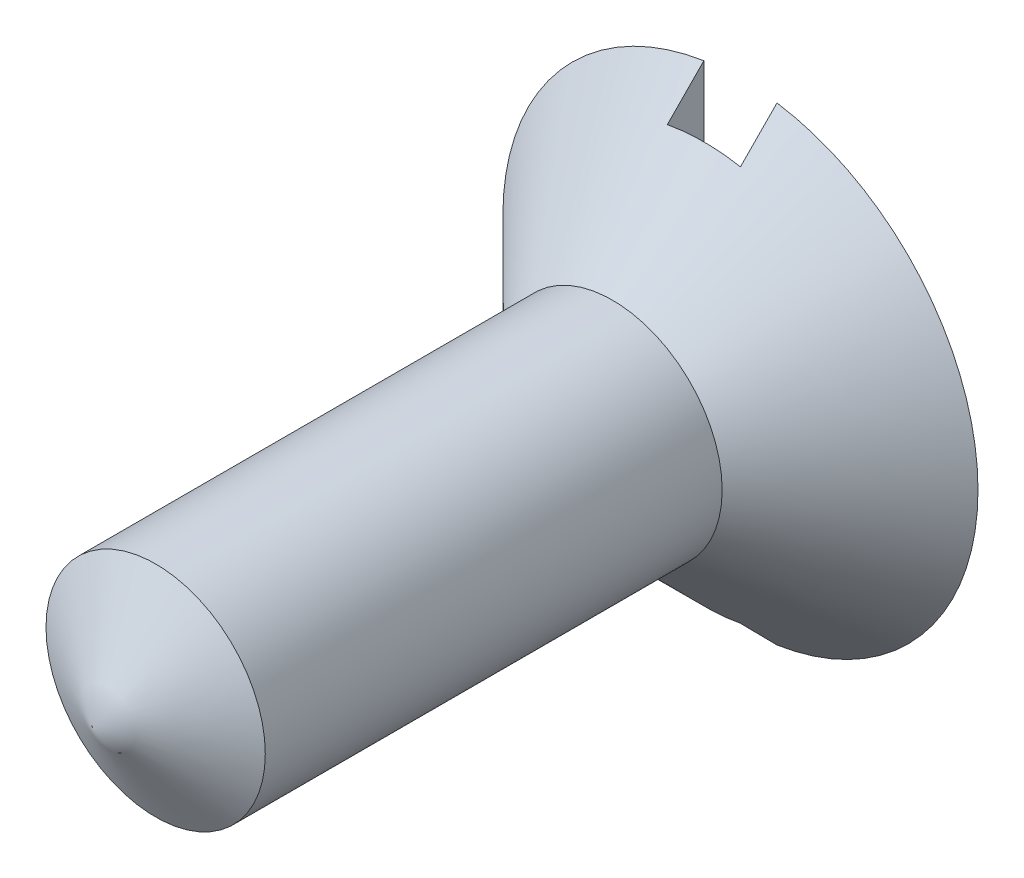
ISO-10303-21;
HEADER;
FILE_DESCRIPTION(('STEP AP214'),'2;1');
FILE_NAME('part.step','',(''),(''),'','','');
FILE_SCHEMA(('AUTOMOTIVE_DESIGN { 1 0 10303 214 1 1 1 1 }'));
ENDSEC;
DATA;
#1=APPLICATION_CONTEXT('core data for automotive mechanical design processes');
#2=APPLICATION_PROTOCOL_DEFINITION('international standard','automotive_design',2000,#1);
#3=PRODUCT_CONTEXT('',#1,'mechanical');
#4=PRODUCT('Part','Part','',(#3));
#5=PRODUCT_RELATED_PRODUCT_CATEGORY('part','',(#4));
#6=PRODUCT_DEFINITION_FORMATION('','',#4);
#7=PRODUCT_DEFINITION_CONTEXT('part definition',#1,'design');
#8=PRODUCT_DEFINITION('design','',#6,#7);
#9=PRODUCT_DEFINITION_SHAPE('','',#8);
#10=(LENGTH_UNIT() NAMED_UNIT(*) SI_UNIT(.MILLI.,.METRE.));
#11=(NAMED_UNIT(*) PLANE_ANGLE_UNIT() SI_UNIT($,.RADIAN.));
#12=(NAMED_UNIT(*) SI_UNIT($,.STERADIAN.) SOLID_ANGLE_UNIT());
#13=UNCERTAINTY_MEASURE_WITH_UNIT(LENGTH_MEASURE(1.E-05),#10,'distance_accuracy_value','');
#14=(GEOMETRIC_REPRESENTATION_CONTEXT(3) GLOBAL_UNCERTAINTY_ASSIGNED_CONTEXT((#13)) GLOBAL_UNIT_ASSIGNED_CONTEXT((#10,
#11,#12)) REPRESENTATION_CONTEXT('',''));
#15=CARTESIAN_POINT('',(0.,0.,0.));
#16=DIRECTION('',(0.,0.,1.));
#17=DIRECTION('',(1.,0.,0.));
#18=AXIS2_PLACEMENT_3D('',#15,#16,#17);
#19=CARTESIAN_POINT('',(3.19724147862266,0.,-44.721048580616));
#20=DIRECTION('',(0.,0.,-1.));
#21=DIRECTION('',(-1.00000000000001,0.,0.));
#22=AXIS2_PLACEMENT_3D('',#19,#20,#21);
#23=CONICAL_SURFACE('',#22,3.,0.785398163397455);
#24=CARTESIAN_POINT('',(3.19724147862266,0.,-44.721048580616));
#25=DIRECTION('',(0.,0.,-1.));
#26=DIRECTION('',(-1.00000000000001,0.,0.));
#27=AXIS2_PLACEMENT_3D('',#24,#25,#26);
#28=CIRCLE('',#27,3.);
#29=CARTESIAN_POINT('',(0.19724147862263,0.,-44.721048580616));
#30=VERTEX_POINT('',#29);
#31=EDGE_CURVE('E140',#30,#30,#28,.T.);
#32=ORIENTED_EDGE('',*,*,#31,.T.);
#33=EDGE_LOOP('',(#32));
#34=FACE_BOUND('',#33,.T.);
#35=CARTESIAN_POINT('',(2.19724147862231,14.2882919475461,-56.0442914668593));
#36=CARTESIAN_POINT('',(2.19724147862254,13.7931991496806,-55.5504164842917));
#37=CARTESIAN_POINT('',(2.19724147862264,13.2980529489614,-55.0565949951455));
#38=CARTESIAN_POINT('',(2.19724147862271,12.307571565195,-54.0691157505036));
#39=CARTESIAN_POINT('',(2.19724147862268,11.8122363775558,-53.5754579996139));
#40=CARTESIAN_POINT('',(2.19724147862266,10.8210233651282,-52.5880926050779));
#41=CARTESIAN_POINT('',(2.19724147862267,10.3251453930802,-52.0943851092347));
#42=CARTESIAN_POINT('',(2.19724147862267,9.3330261167956,-51.1073605080941));
#43=CARTESIAN_POINT('',(2.19724147862267,8.83678482211178,-50.6140433931953));
#44=CARTESIAN_POINT('',(2.19724147862267,7.84417904493086,-49.628486967335));
#45=CARTESIAN_POINT('',(2.19724147862267,7.34781513888531,-49.1362470762193));
#46=CARTESIAN_POINT('',(2.19724147862267,6.60243575566865,-48.3986904042511));
#47=CARTESIAN_POINT('',(2.19724147862267,6.3538272739522,-48.1529624194978));
#48=CARTESIAN_POINT('',(2.19724147862267,5.85622415040261,-47.6619014406368));
#49=CARTESIAN_POINT('',(2.19724147862267,5.60722951151101,-47.4165684435491));
#50=CARTESIAN_POINT('',(2.19724147862267,5.10876935550571,-46.9265668209369));
#51=CARTESIAN_POINT('',(2.19724147862267,4.85930404862084,-46.6818979817721));
#52=CARTESIAN_POINT('',(2.19724147862267,4.35949131374657,-46.1934482449939));
#53=CARTESIAN_POINT('',(2.19724147862267,4.10914386022245,-45.949667373506));
#54=CARTESIAN_POINT('',(2.19724147862267,3.60705396513095,-45.463609682291));
#55=CARTESIAN_POINT('',(2.19724147862268,3.35531172046854,-45.2213326600115));
#56=CARTESIAN_POINT('',(2.19724147862267,2.97568860139423,-44.8600388438273));
#57=CARTESIAN_POINT('',(2.19724147862266,2.84881557856686,-44.7399639606034));
#58=CARTESIAN_POINT('',(2.19724147862268,2.5940897747517,-44.5008588093708));
#59=CARTESIAN_POINT('',(2.1972414786227,2.4662370118921,-44.381828522121));
#60=CARTESIAN_POINT('',(2.19724147862268,2.30259268257825,-44.2313767302532));
#61=CARTESIAN_POINT('',(2.19724147862267,2.26748579943915,-44.1992103740221));
#62=CARTESIAN_POINT('',(2.19724147862267,2.19714533308812,-44.135016297894));
#63=CARTESIAN_POINT('',(2.19724147862267,2.16191174947648,-44.1029885784351));
#64=CARTESIAN_POINT('',(2.19724147862267,2.0559947776203,-44.0071388838725));
#65=CARTESIAN_POINT('',(2.19724147862267,1.9850975512549,-43.9435525679257));
#66=CARTESIAN_POINT('',(2.19724147862267,1.84245260371092,-43.817125399937));
#67=CARTESIAN_POINT('',(2.19724147862267,1.77070377850774,-43.7542857913147));
#68=CARTESIAN_POINT('',(2.19724147862268,1.62621102985629,-43.6297690323738));
#69=CARTESIAN_POINT('',(2.19724147862269,1.55346719355343,-43.5680917813642));
#70=CARTESIAN_POINT('',(2.19724147862269,1.41793948539106,-43.4557949997619));
#71=CARTESIAN_POINT('',(2.19724147862267,1.355352393353,-43.4049387792363));
#72=CARTESIAN_POINT('',(2.19724147862267,1.22885700956022,-43.3049004520665));
#73=CARTESIAN_POINT('',(2.19724147862267,1.16494886553124,-43.2557181598467));
#74=CARTESIAN_POINT('',(2.19724147862267,1.03535835444672,-43.1598200834689));
#75=CARTESIAN_POINT('',(2.19724147862267,0.969677186173313,-43.1131026928954));
#76=CARTESIAN_POINT('',(2.19724147862268,0.835831829770626,-43.0234077291359));
#77=CARTESIAN_POINT('',(2.19724147862269,0.767669501659799,-42.9804274331104));
#78=CARTESIAN_POINT('',(2.19724147862268,0.633576189631235,-42.9036910897899));
#79=CARTESIAN_POINT('',(2.19724147862265,0.567917961918426,-42.8694682901112));
#80=CARTESIAN_POINT('',(2.19724147862269,0.432959563990272,-42.8090894127294));
#81=CARTESIAN_POINT('',(2.19724147862275,0.363666728977094,-42.782917768128));
#82=CARTESIAN_POINT('',(2.19724147862274,0.235023492173495,-42.7468214018993));
#83=CARTESIAN_POINT('',(2.19724147862269,0.176303131568325,-42.7347478420954));
#84=CARTESIAN_POINT('',(2.19724147862266,0.0577122022572557,-42.7209935432606));
#85=CARTESIAN_POINT('',(2.19724147862268,-0.00215558002677744,-42.7192902059533));
#86=CARTESIAN_POINT('',(2.19724147862269,-0.121153041311664,-42.726604608173));
#87=CARTESIAN_POINT('',(2.19724147862268,-0.180283326141191,-42.7356128694053));
#88=CARTESIAN_POINT('',(2.19724147862267,-0.267387411997993,-42.755786857806));
#89=CARTESIAN_POINT('',(2.19724147862267,-0.296197988828033,-42.7636382254871));
#90=CARTESIAN_POINT('',(2.19724147862268,-0.353229424922568,-42.7812561122169));
#91=CARTESIAN_POINT('',(2.19724147862268,-0.381450291003875,-42.7910226091139));
#92=CARTESIAN_POINT('',(2.19724147862269,-0.481668705166372,-42.8289778072497));
#93=CARTESIAN_POINT('',(2.19724147862268,-0.551918633912305,-42.8617651060375));
#94=CARTESIAN_POINT('',(2.19724147862267,-0.688934860994901,-42.9339924748972));
#95=CARTESIAN_POINT('',(2.19724147862267,-0.755692393708852,-42.9734483232245));
#96=CARTESIAN_POINT('',(2.19724147862267,-0.887145262528723,-43.0568751651356));
#97=CARTESIAN_POINT('',(2.19724147862268,-0.95181644823838,-43.1008838123841));
#98=CARTESIAN_POINT('',(2.19724147862267,-1.04729746297208,-43.1689231794965));
#99=CARTESIAN_POINT('',(2.19724147862266,-1.07885327771418,-43.1919275246561));
#100=CARTESIAN_POINT('',(2.19724147862268,-1.14154126505463,-43.2385056158613));
#101=CARTESIAN_POINT('',(2.1972414786227,-1.17267345224238,-43.2620793422199));
#102=CARTESIAN_POINT('',(2.19724147862274,-1.27314519842653,-43.3393549576757));
#103=CARTESIAN_POINT('',(2.19724147862269,-1.34175929657053,-43.3939989478146));
#104=CARTESIAN_POINT('',(2.19724147862265,-1.47769422647023,-43.5048767959592));
#105=CARTESIAN_POINT('',(2.19724147862267,-1.54501489226988,-43.5611108557236));
#106=CARTESIAN_POINT('',(2.19724147862268,-1.6787211254441,-43.6747277189228));
#107=CARTESIAN_POINT('',(2.19724147862267,-1.74510633165601,-43.7321109463891));
#108=CARTESIAN_POINT('',(2.19724147862267,-1.87715040010697,-43.8477082730395));
#109=CARTESIAN_POINT('',(2.19724147862267,-1.94280924268663,-43.905922394615));
#110=CARTESIAN_POINT('',(2.19724147862267,-2.13914833306776,-44.0816661039433));
#111=CARTESIAN_POINT('',(2.19724147862267,-2.26899392236346,-44.2001271201258));
#112=CARTESIAN_POINT('',(2.19724147862267,-2.52726669106789,-44.4385184968488));
#113=CARTESIAN_POINT('',(2.19724147862267,-2.6556941856438,-44.5584485178797));
#114=CARTESIAN_POINT('',(2.19724147862267,-2.91084964047311,-44.7985797571294));
#115=CARTESIAN_POINT('',(2.19724147862267,-3.03758317163571,-44.9187750615788));
#116=CARTESIAN_POINT('',(2.19724147862267,-3.29041057161204,-45.1598501689583));
#117=CARTESIAN_POINT('',(2.19724147862267,-3.41650440278681,-45.2807300112999));
#118=CARTESIAN_POINT('',(2.19724147862267,-3.66811416418877,-45.522876522096));
#119=CARTESIAN_POINT('',(2.19724147862267,-3.79363049342172,-45.6441427762137));
#120=CARTESIAN_POINT('',(2.19724147862267,-4.04430722831117,-45.8870376290901));
#121=CARTESIAN_POINT('',(2.19724147862268,-4.16946764067457,-46.0086662209313));
#122=CARTESIAN_POINT('',(2.19724147862269,-4.50378665611531,-46.3342715094442));
#123=CARTESIAN_POINT('',(2.19724147862268,-4.71270234269405,-46.5384975649853));
#124=CARTESIAN_POINT('',(2.19724147862267,-5.13002574367335,-46.9474681827113));
#125=CARTESIAN_POINT('',(2.19724147862267,-5.33843345729071,-47.1522127456945));
#126=CARTESIAN_POINT('',(2.19724147862268,-5.96313151059699,-47.7669888659768));
#127=CARTESIAN_POINT('',(2.19724147862267,-6.37889223898194,-48.1775584332769));
#128=CARTESIAN_POINT('',(2.19724147862267,-7.20980779499494,-48.9996313263225));
#129=CARTESIAN_POINT('',(2.19724147862267,-7.62496232500945,-49.4111349525136));
#130=CARTESIAN_POINT('',(2.19724147862267,-8.45479315552847,-50.2346203239024));
#131=CARTESIAN_POINT('',(2.19724147862267,-8.86946945819171,-50.6466020669249));
#132=CARTESIAN_POINT('',(2.19724147862267,-9.70152004525976,-51.4738689857152));
#133=CARTESIAN_POINT('',(2.19724147862267,-10.1188920677697,-51.8891564357601));
#134=CARTESIAN_POINT('',(2.19724147862267,-10.9534191951377,-52.7199504802962));
#135=CARTESIAN_POINT('',(2.19724147862267,-11.370574299665,-53.1354570751196));
#136=CARTESIAN_POINT('',(2.19724147862267,-12.2045555904901,-53.9664530469373));
#137=CARTESIAN_POINT('',(2.19724147862268,-12.6213818414202,-54.3819423590739));
#138=CARTESIAN_POINT('',(2.19724147862266,-13.4549160526207,-55.2130382351294));
#139=CARTESIAN_POINT('',(2.19724147862263,-13.8716240130872,-55.6286447988517));
#140=CARTESIAN_POINT('',(2.19724147862256,-14.2882919475464,-56.0442914668591));
#141=B_SPLINE_CURVE_WITH_KNOTS('',3,(#35,#36,#37,#38,#39,#40,#41,#42,#43,#44,#45,#46,#47,#48,
#49,#50,#51,#52,#53,#54,#55,#56,#57,#58,#59,#60,#61,#62,#63,#64,#65,#66,#67,#68,#69,#70,#71,#72,
#73,#74,#75,#76,#77,#78,#79,#80,#81,#82,#83,#84,#85,#86,#87,#88,#89,#90,#91,#92,#93,#94,#95,#96,
#97,#98,#99,#100,#101,#102,#103,#104,#105,#106,#107,#108,#109,#110,#111,#112,#113,#114,#115,
#116,#117,#118,#119,#120,#121,#122,#123,#124,#125,#126,#127,#128,#129,#130,#131,#132,#133,#134,
#135,#136,#137,#138,#139,#140),.UNSPECIFIED.,.F.,.F.,(4,2,2,2,2,2,2,2,2,2,2,2,2,2,2,2,2,2,2,2,2,
2,2,2,2,2,2,2,2,2,2,2,2,2,2,2,2,2,2,2,2,2,2,2,2,2,2,2,2,2,2,2,4),(0.,2.09791909992469,
4.19589291347944,6.29512559708209,8.39430493737686,10.4914673975049,11.54013088667,
12.5887864264775,13.6370508994306,14.6853459690205,15.7334966395419,16.2575475874514,
16.7815888621217,16.9244328905676,17.0672773700416,17.3529760487642,17.6390978226925,
17.9251946958512,18.1671083327936,18.4089950627045,18.6507221530306,18.8922716192769,
19.1140842979421,19.3354653667043,19.5145469303337,19.6932381081807,19.8717712864517,
19.9613010347588,20.0508297475659,20.282723471328,20.5151737564224,20.7497291313855,
20.8668783357662,20.9840234953581,21.2471274399523,21.5102649200997,21.7735013527844,
22.0367448927454,22.5640127876292,23.0911610396502,23.6151559361911,24.1391813142896,
24.6627628651923,25.1863344834823,26.0627953844601,26.939257635924,28.6922011153726,
30.4458246118492,32.1994401611937,33.9657830795502,35.7321286829259,37.4977388719628,
39.2633461177801),.UNSPECIFIED.);
#142=CARTESIAN_POINT('',(2.19724147862384,-5.40832691319598,-47.2210485806159));
#143=VERTEX_POINT('',#142);
#144=CARTESIAN_POINT('',(2.19724147862282,-6.42261628933255,-48.2210485806159));
#145=VERTEX_POINT('',#144);
#146=EDGE_CURVE('E98',#143,#145,#141,.T.);
#147=ORIENTED_EDGE('',*,*,#146,.F.);
#148=CARTESIAN_POINT('',(3.19724147862266,0.,-47.2210485806159));
#149=DIRECTION('',(0.,0.,-1.));
#150=DIRECTION('',(-1.00000000000001,0.,0.));
#151=AXIS2_PLACEMENT_3D('',#148,#149,#150);
#152=CIRCLE('',#151,5.49999999999998);
#153=CARTESIAN_POINT('',(4.19724147862387,-5.40832691319595,-47.2210485806159));
#154=VERTEX_POINT('',#153);
#155=EDGE_CURVE('E11',#154,#143,#152,.T.);
#156=ORIENTED_EDGE('',*,*,#155,.F.);
#157=CARTESIAN_POINT('',(4.19724147862267,-14.2882919475464,-56.0442914668591));
#158=CARTESIAN_POINT('',(4.19724147862269,-13.7931991496807,-55.5504164842917));
#159=CARTESIAN_POINT('',(4.1972414786227,-13.2980529489614,-55.0565949951455));
#160=CARTESIAN_POINT('',(4.1972414786227,-12.3075715651949,-54.0691157505036));
#161=CARTESIAN_POINT('',(4.1972414786227,-11.8122363775558,-53.5754579996139));
#162=CARTESIAN_POINT('',(4.1972414786227,-10.8210233651281,-52.5880926050778));
#163=CARTESIAN_POINT('',(4.1972414786227,-10.3251453930801,-52.0943851092346));
#164=CARTESIAN_POINT('',(4.1972414786227,-9.33302611679544,-51.107360508094));
#165=CARTESIAN_POINT('',(4.1972414786227,-8.83678482211161,-50.6140433931952));
#166=CARTESIAN_POINT('',(4.1972414786227,-7.84417904493069,-49.6284869673348));
#167=CARTESIAN_POINT('',(4.1972414786227,-7.34781513888514,-49.1362470762191));
#168=CARTESIAN_POINT('',(4.1972414786227,-6.6024357556685,-48.398690404251));
#169=CARTESIAN_POINT('',(4.1972414786227,-6.35382727395206,-48.1529624194976));
#170=CARTESIAN_POINT('',(4.1972414786227,-5.85622415040248,-47.6619014406367));
#171=CARTESIAN_POINT('',(4.1972414786227,-5.60722951151089,-47.416568443549));
#172=CARTESIAN_POINT('',(4.1972414786227,-5.10876935550561,-46.9265668209368));
#173=CARTESIAN_POINT('',(4.1972414786227,-4.85930404862073,-46.681897981772));
#174=CARTESIAN_POINT('',(4.1972414786227,-4.35949131374649,-46.1934482449938));
#175=CARTESIAN_POINT('',(4.19724147862269,-4.10914386022237,-45.9496673735059));
#176=CARTESIAN_POINT('',(4.19724147862271,-3.60705396513089,-45.463609682291));
#177=CARTESIAN_POINT('',(4.19724147862273,-3.35531172046848,-45.2213326600114));
#178=CARTESIAN_POINT('',(4.19724147862269,-2.97568860139418,-44.8600388438273));
#179=CARTESIAN_POINT('',(4.19724147862266,-2.84881557856682,-44.7399639606034));
#180=CARTESIAN_POINT('',(4.19724147862274,-2.59408977475167,-44.5008588093708));
#181=CARTESIAN_POINT('',(4.19724147862285,-2.46623701189207,-44.381828522121));
#182=CARTESIAN_POINT('',(4.19724147862275,-2.30259268257822,-44.2313767302532));
#183=CARTESIAN_POINT('',(4.19724147862271,-2.26748579943912,-44.1992103740221));
#184=CARTESIAN_POINT('',(4.19724147862269,-2.19714533308808,-44.135016297894));
#185=CARTESIAN_POINT('',(4.1972414786227,-2.16191174947645,-44.1029885784351));
#186=CARTESIAN_POINT('',(4.19724147862271,-2.05599477762026,-44.0071388838725));
#187=CARTESIAN_POINT('',(4.19724147862271,-1.98509755125487,-43.9435525679257));
#188=CARTESIAN_POINT('',(4.19724147862269,-1.84245260371089,-43.817125399937));
#189=CARTESIAN_POINT('',(4.19724147862268,-1.77070377850771,-43.7542857913147));
#190=CARTESIAN_POINT('',(4.19724147862272,-1.62621102985626,-43.6297690323738));
#191=CARTESIAN_POINT('',(4.19724147862278,-1.5534671935534,-43.5680917813642));
#192=CARTESIAN_POINT('',(4.19724147862277,-1.41793948539103,-43.4557949997619));
#193=CARTESIAN_POINT('',(4.19724147862272,-1.35535239335297,-43.4049387792363));
#194=CARTESIAN_POINT('',(4.19724147862269,-1.22885700956019,-43.3049004520665));
#195=CARTESIAN_POINT('',(4.1972414786227,-1.1649488655312,-43.2557181598467));
#196=CARTESIAN_POINT('',(4.1972414786227,-1.03535835444668,-43.1598200834689));
#197=CARTESIAN_POINT('',(4.19724147862268,-0.969677186173265,-43.1131026928955));
#198=CARTESIAN_POINT('',(4.19724147862272,-0.835831829770584,-43.0234077291359));
#199=CARTESIAN_POINT('',(4.19724147862277,-0.76766950165977,-42.9804274331104));
#200=CARTESIAN_POINT('',(4.19724147862277,-0.633576189631209,-42.9036910897899));
#201=CARTESIAN_POINT('',(4.19724147862272,-0.567917961918392,-42.8694682901112));
#202=CARTESIAN_POINT('',(4.19724147862268,-0.432959563990249,-42.8090894127294));
#203=CARTESIAN_POINT('',(4.19724147862268,-0.363666728977089,-42.782917768128));
#204=CARTESIAN_POINT('',(4.19724147862269,-0.235023492173497,-42.7468214018993));
#205=CARTESIAN_POINT('',(4.1972414786227,-0.176303131568319,-42.7347478420954));
#206=CARTESIAN_POINT('',(4.1972414786227,-0.057712202257246,-42.7209935432606));
#207=CARTESIAN_POINT('',(4.19724147862269,0.00215558002678365,-42.7192902059533));
#208=CARTESIAN_POINT('',(4.19724147862269,0.121153041311657,-42.7266046081729));
#209=CARTESIAN_POINT('',(4.1972414786227,0.180283326141175,-42.7356128694053));
#210=CARTESIAN_POINT('',(4.1972414786227,0.267387411997971,-42.755786857806));
#211=CARTESIAN_POINT('',(4.19724147862271,0.296197988828012,-42.7636382254871));
#212=CARTESIAN_POINT('',(4.1972414786227,0.353229424922556,-42.7812561122169));
#213=CARTESIAN_POINT('',(4.19724147862269,0.381450291003872,-42.7910226091139));
#214=CARTESIAN_POINT('',(4.19724147862268,0.481668705166381,-42.8289778072497));
#215=CARTESIAN_POINT('',(4.1972414786227,0.551918633912292,-42.8617651060375));
#216=CARTESIAN_POINT('',(4.19724147862271,0.688934860994875,-42.9339924748972));
#217=CARTESIAN_POINT('',(4.1972414786227,0.755692393708834,-42.9734483232246));
#218=CARTESIAN_POINT('',(4.1972414786227,0.887145262528715,-43.0568751651356));
#219=CARTESIAN_POINT('',(4.1972414786227,0.951816448238374,-43.1008838123841));
#220=CARTESIAN_POINT('',(4.1972414786227,1.04729746297206,-43.1689231794965));
#221=CARTESIAN_POINT('',(4.1972414786227,1.07885327771416,-43.1919275246562));
#222=CARTESIAN_POINT('',(4.1972414786227,1.14154126505462,-43.2385056158614));
#223=CARTESIAN_POINT('',(4.19724147862269,1.17267345224237,-43.2620793422199));
#224=CARTESIAN_POINT('',(4.19724147862268,1.27314519842653,-43.3393549576756));
#225=CARTESIAN_POINT('',(4.1972414786227,1.34175929657051,-43.3939989478146));
#226=CARTESIAN_POINT('',(4.19724147862271,1.47769422647019,-43.5048767959592));
#227=CARTESIAN_POINT('',(4.1972414786227,1.54501489226984,-43.5611108557236));
#228=CARTESIAN_POINT('',(4.1972414786227,1.67872112544405,-43.6747277189228));
#229=CARTESIAN_POINT('',(4.1972414786227,1.74510633165596,-43.7321109463891));
#230=CARTESIAN_POINT('',(4.1972414786227,1.87715040010691,-43.8477082730395));
#231=CARTESIAN_POINT('',(4.1972414786227,1.94280924268656,-43.905922394615));
#232=CARTESIAN_POINT('',(4.1972414786227,2.13914833306769,-44.0816661039433));
#233=CARTESIAN_POINT('',(4.1972414786227,2.26899392236338,-44.2001271201257));
#234=CARTESIAN_POINT('',(4.1972414786227,2.5272666910678,-44.4385184968487));
#235=CARTESIAN_POINT('',(4.1972414786227,2.6556941856437,-44.5584485178796));
#236=CARTESIAN_POINT('',(4.1972414786227,2.910849640473,-44.7985797571293));
#237=CARTESIAN_POINT('',(4.1972414786227,3.0375831716356,-44.9187750615787));
#238=CARTESIAN_POINT('',(4.1972414786227,3.29041057161193,-45.1598501689582));
#239=CARTESIAN_POINT('',(4.1972414786227,3.4165044027867,-45.2807300112998));
#240=CARTESIAN_POINT('',(4.1972414786227,3.66811416418866,-45.5228765220959));
#241=CARTESIAN_POINT('',(4.19724147862271,3.7936304934216,-45.6441427762136));
#242=CARTESIAN_POINT('',(4.1972414786227,4.04430722831106,-45.88703762909));
#243=CARTESIAN_POINT('',(4.19724147862269,4.16946764067446,-46.0086662209312));
#244=CARTESIAN_POINT('',(4.19724147862268,4.50378665611522,-46.3342715094441));
#245=CARTESIAN_POINT('',(4.1972414786227,4.71270234269396,-46.5384975649852));
#246=CARTESIAN_POINT('',(4.19724147862271,5.13002574367328,-46.9474681827112));
#247=CARTESIAN_POINT('',(4.1972414786227,5.33843345729065,-47.1522127456945));
#248=CARTESIAN_POINT('',(4.1972414786227,5.96313151059697,-47.7669888659768));
#249=CARTESIAN_POINT('',(4.1972414786227,6.37889223898194,-48.1775584332769));
#250=CARTESIAN_POINT('',(4.1972414786227,7.20980779499499,-48.9996313263226));
#251=CARTESIAN_POINT('',(4.1972414786227,7.62496232500952,-49.4111349525137));
#252=CARTESIAN_POINT('',(4.1972414786227,8.45479315552859,-50.2346203239025));
#253=CARTESIAN_POINT('',(4.1972414786227,8.86946945819185,-50.646602066925));
#254=CARTESIAN_POINT('',(4.1972414786227,9.70152004525991,-51.4738689857154));
#255=CARTESIAN_POINT('',(4.1972414786227,10.1188920677698,-51.8891564357603));
#256=CARTESIAN_POINT('',(4.1972414786227,10.9534191951378,-52.7199504802963));
#257=CARTESIAN_POINT('',(4.19724147862269,11.3705742996651,-53.1354570751197));
#258=CARTESIAN_POINT('',(4.19724147862271,12.2045555904901,-53.9664530469373));
#259=CARTESIAN_POINT('',(4.19724147862274,12.6213818414203,-54.3819423590739));
#260=CARTESIAN_POINT('',(4.19724147862267,13.4549160526207,-55.2130382351295));
#261=CARTESIAN_POINT('',(4.19724147862257,13.8716240130871,-55.6286447988517));
#262=CARTESIAN_POINT('',(4.19724147862234,14.2882919475461,-56.0442914668593));
#263=B_SPLINE_CURVE_WITH_KNOTS('',3,(#157,#158,#159,#160,#161,#162,#163,#164,#165,#166,#167,
#168,#169,#170,#171,#172,#173,#174,#175,#176,#177,#178,#179,#180,#181,#182,#183,#184,#185,#186,
#187,#188,#189,#190,#191,#192,#193,#194,#195,#196,#197,#198,#199,#200,#201,#202,#203,#204,#205,
#206,#207,#208,#209,#210,#211,#212,#213,#214,#215,#216,#217,#218,#219,#220,#221,#222,#223,#224,
#225,#226,#227,#228,#229,#230,#231,#232,#233,#234,#235,#236,#237,#238,#239,#240,#241,#242,#243,
#244,#245,#246,#247,#248,#249,#250,#251,#252,#253,#254,#255,#256,#257,#258,#259,#260,#261,#262),
.UNSPECIFIED.,.F.,.F.,(4,2,2,2,2,2,2,2,2,2,2,2,2,2,2,2,2,2,2,2,2,2,2,2,2,2,2,2,2,2,2,2,2,2,2,2,
2,2,2,2,2,2,2,2,2,2,2,2,2,2,2,2,4),(0.,2.09791909992476,4.19589291347959,6.29512559708232,
8.39430493737718,10.4914673975052,11.5401308866703,12.5887864264777,13.6370508994308,
14.6853459690207,15.733496639542,16.2575475874515,16.7815888621218,16.9244328905677,
17.0672773700417,17.3529760487643,17.6390978226925,17.9251946958513,18.1671083327937,
18.4089950627046,18.6507221530307,18.892271619277,19.1140842979422,19.3354653667043,
19.5145469303337,19.6932381081808,19.8717712864518,19.9613010347589,20.0508297475659,
20.282723471328,20.5151737564225,20.7497291313856,20.8668783357662,20.9840234953582,
21.2471274399523,21.5102649200997,21.7735013527843,22.0367448927454,22.5640127876291,
23.0911610396502,23.615155936191,24.1391813142896,24.6627628651922,25.1863344834822,
26.06279538446,26.939257635924,28.6922011153726,30.4458246118493,32.1994401611939,
33.9657830795504,35.7321286829261,37.4977388719629,39.2633461177801),.UNSPECIFIED.);
#264=CARTESIAN_POINT('',(4.19724147862297,-6.42261628933255,-48.2210485806159));
#265=VERTEX_POINT('',#264);
#266=EDGE_CURVE('E91',#265,#154,#263,.T.);
#267=ORIENTED_EDGE('',*,*,#266,.F.);
#268=CARTESIAN_POINT('',(3.19724147862265,0.,-48.2210485806159));
#269=DIRECTION('',(0.,0.,-1.));
#270=DIRECTION('',(-1.00000000000001,0.,0.));
#271=AXIS2_PLACEMENT_3D('',#268,#269,#270);
#272=CIRCLE('',#271,6.5);
#273=CARTESIAN_POINT('',(4.1972414786224,6.42261628933261,-48.2210485806159));
#274=VERTEX_POINT('',#273);
#275=EDGE_CURVE('E96',#274,#265,#272,.T.);
#276=ORIENTED_EDGE('',*,*,#275,.F.);
#277=CARTESIAN_POINT('',(4.19724147862269,5.40832691319598,-47.2210485806159));
#278=VERTEX_POINT('',#277);
#279=EDGE_CURVE('E54',#278,#274,#263,.T.);
#280=ORIENTED_EDGE('',*,*,#279,.F.);
#281=CARTESIAN_POINT('',(2.19724147862269,5.40832691319595,-47.2210485806159));
#282=VERTEX_POINT('',#281);
#283=EDGE_CURVE('E43',#282,#278,#152,.T.);
#284=ORIENTED_EDGE('',*,*,#283,.F.);
#285=CARTESIAN_POINT('',(2.19724147862245,6.42261628933255,-48.2210485806159));
#286=VERTEX_POINT('',#285);
#287=EDGE_CURVE('E139',#286,#282,#141,.T.);
#288=ORIENTED_EDGE('',*,*,#287,.F.);
#289=EDGE_CURVE('E137',#145,#286,#272,.T.);
#290=ORIENTED_EDGE('',*,*,#289,.F.);
#291=EDGE_LOOP('',(#147,#156,#267,#276,#280,#284,#288,#290));
#292=FACE_BOUND('',#291,.T.);
#293=ADVANCED_FACE('F39',(#34,#292),#23,.T.);
#294=CARTESIAN_POINT('',(3.19724147862265,0.,-48.2210485806159));
#295=DIRECTION('',(0.,0.,1.));
#296=DIRECTION('',(1.00000000000001,0.,0.));
#297=AXIS2_PLACEMENT_3D('',#294,#295,#296);
#298=PLANE('',#297);
#299=DIRECTION('',(0.,1.00000000000001,0.));
#300=VECTOR('',#299,1.);
#301=CARTESIAN_POINT('',(2.19724147862251,0.,-48.2210485806159));
#302=LINE('',#301,#300);
#303=EDGE_CURVE('E88',#145,#286,#302,.T.);
#304=ORIENTED_EDGE('',*,*,#303,.F.);
#305=ORIENTED_EDGE('',*,*,#289,.T.);
#306=EDGE_LOOP('',(#304,#305));
#307=FACE_BOUND('',#306,.T.);
#308=ADVANCED_FACE('F124',(#307),#298,.F.);
#309=DIRECTION('',(0.,-1.00000000000001,0.));
#310=VECTOR('',#309,1.);
#311=CARTESIAN_POINT('',(4.19724147862267,0.,-48.2210485806159));
#312=LINE('',#311,#310);
#313=EDGE_CURVE('E138',#274,#265,#312,.T.);
#314=ORIENTED_EDGE('',*,*,#313,.F.);
#315=ORIENTED_EDGE('',*,*,#275,.T.);
#316=EDGE_LOOP('',(#314,#315));
#317=FACE_BOUND('',#316,.T.);
#318=ADVANCED_FACE('F126',(#317),#298,.F.);
#319=CARTESIAN_POINT('',(3.19724147862266,0.,-30.4889977730477));
#320=DIRECTION('',(0.,0.,-1.));
#321=DIRECTION('',(-1.00000000000001,0.,0.));
#322=AXIS2_PLACEMENT_3D('',#319,#320,#321);
#323=CONICAL_SURFACE('',#322,0.,1.0471975511966);
#324=CARTESIAN_POINT('',(3.19724147862266,0.,-32.2210485806166));
#325=DIRECTION('',(0.,0.,-1.));
#326=DIRECTION('',(-1.00000000000001,0.,0.));
#327=AXIS2_PLACEMENT_3D('',#324,#325,#326);
#328=CIRCLE('',#327,3.);
#329=CARTESIAN_POINT('',(0.197241478622629,0.,-32.2210485806166));
#330=VERTEX_POINT('',#329);
#331=EDGE_CURVE('E144',#330,#330,#328,.T.);
#332=ORIENTED_EDGE('',*,*,#331,.F.);
#333=EDGE_LOOP('',(#332));
#334=FACE_BOUND('',#333,.T.);
#335=CARTESIAN_POINT('',(3.19724147862266,0.,-30.4889977730477));
#336=VERTEX_POINT('',#335);
#337=VERTEX_LOOP('',#336);
#338=FACE_BOUND('',#337,.T.);
#339=ADVANCED_FACE('F41',(#334,#338),#323,.T.);
#340=CARTESIAN_POINT('',(3.19724147862265,0.,-48.2210485806159));
#341=DIRECTION('',(0.,0.,-1.));
#342=DIRECTION('',(-1.00000000000001,0.,0.));
#343=AXIS2_PLACEMENT_3D('',#340,#341,#342);
#344=CYLINDRICAL_SURFACE('',#343,3.);
#345=ORIENTED_EDGE('',*,*,#31,.F.);
#346=EDGE_LOOP('',(#345));
#347=FACE_BOUND('',#346,.T.);
#348=ORIENTED_EDGE('',*,*,#331,.T.);
#349=EDGE_LOOP('',(#348));
#350=FACE_BOUND('',#349,.T.);
#351=ADVANCED_FACE('F120',(#347,#350),#344,.T.);
#352=CARTESIAN_POINT('',(2.19724147862269,6.50000000000001,-47.2210485806159));
#353=DIRECTION('',(0.,0.,-1.));
#354=DIRECTION('',(-1.00000000000001,0.,0.));
#355=AXIS2_PLACEMENT_3D('',#352,#353,#354);
#356=PLANE('',#355);
#357=ORIENTED_EDGE('',*,*,#283,.T.);
#358=DIRECTION('',(0.,-1.00000000000001,0.));
#359=VECTOR('',#358,1.);
#360=CARTESIAN_POINT('',(4.19724147862271,6.50000000000003,-47.2210485806159));
#361=LINE('',#360,#359);
#362=EDGE_CURVE('E82',#278,#154,#361,.T.);
#363=ORIENTED_EDGE('',*,*,#362,.T.);
#364=ORIENTED_EDGE('',*,*,#155,.T.);
#365=DIRECTION('',(0.,-1.00000000000001,0.));
#366=VECTOR('',#365,1.);
#367=CARTESIAN_POINT('',(2.19724147862269,6.50000000000001,-47.2210485806159));
#368=LINE('',#367,#366);
#369=EDGE_CURVE('E85',#282,#143,#368,.T.);
#370=ORIENTED_EDGE('',*,*,#369,.F.);
#371=EDGE_LOOP('',(#357,#363,#364,#370));
#372=FACE_BOUND('',#371,.T.);
#373=ADVANCED_FACE('F81',(#372),#356,.T.);
#374=CARTESIAN_POINT('',(2.19724147862267,6.50000000000001,-48.2210485806159));
#375=DIRECTION('',(1.00000000000001,0.,0.));
#376=DIRECTION('',(0.,0.,-1.));
#377=AXIS2_PLACEMENT_3D('',#374,#375,#376);
#378=PLANE('',#377);
#379=ORIENTED_EDGE('',*,*,#287,.T.);
#380=ORIENTED_EDGE('',*,*,#369,.T.);
#381=ORIENTED_EDGE('',*,*,#146,.T.);
#382=ORIENTED_EDGE('',*,*,#303,.T.);
#383=EDGE_LOOP('',(#379,#380,#381,#382));
#384=FACE_BOUND('',#383,.T.);
#385=ADVANCED_FACE('F118',(#384),#378,.T.);
#386=CARTESIAN_POINT('',(4.1972414786227,6.50000000000003,-48.2210485806159));
#387=DIRECTION('',(-1.00000000000001,0.,0.));
#388=DIRECTION('',(0.,0.,1.));
#389=AXIS2_PLACEMENT_3D('',#386,#387,#388);
#390=PLANE('',#389);
#391=ORIENTED_EDGE('',*,*,#266,.T.);
#392=ORIENTED_EDGE('',*,*,#362,.F.);
#393=ORIENTED_EDGE('',*,*,#279,.T.);
#394=ORIENTED_EDGE('',*,*,#313,.T.);
#395=EDGE_LOOP('',(#391,#392,#393,#394));
#396=FACE_BOUND('',#395,.T.);
#397=ADVANCED_FACE('F89',(#396),#390,.T.);
#398=CLOSED_SHELL('',(#293,#308,#318,#339,#351,#373,#385,#397));
#399=MANIFOLD_SOLID_BREP('B2',#398);
#400=ADVANCED_BREP_SHAPE_REPRESENTATION('',(#18,#399),#14);
#401=SHAPE_DEFINITION_REPRESENTATION(#9,#400);
ENDSEC;
END-ISO-10303-21;
